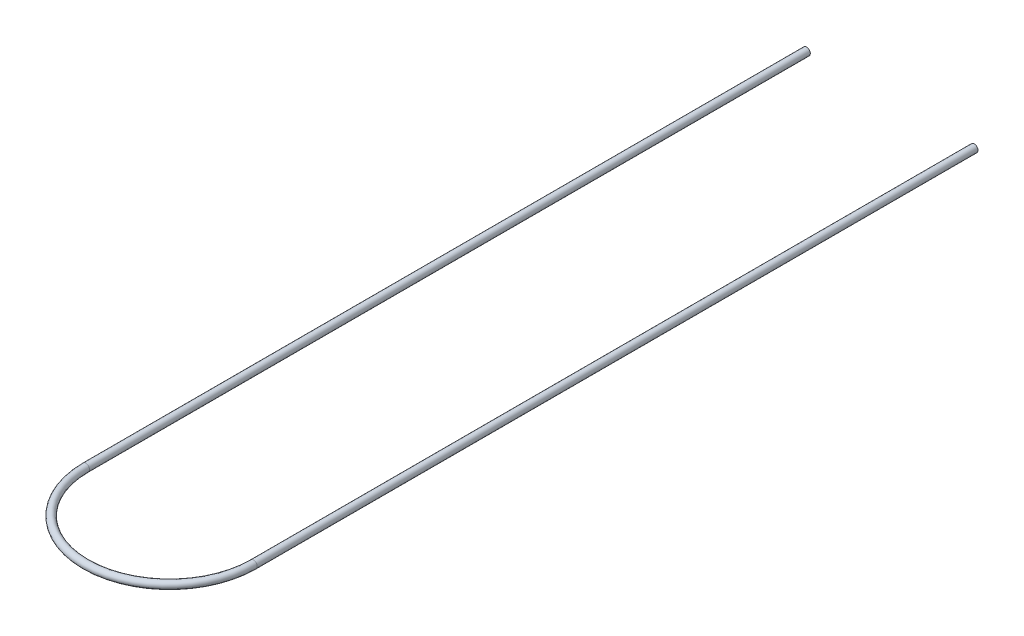
ISO-10303-21;
HEADER;
FILE_DESCRIPTION(('STEP AP214'),'2;1');
FILE_NAME('part.step','',(''),(''),'','','');
FILE_SCHEMA(('AUTOMOTIVE_DESIGN { 1 0 10303 214 1 1 1 1 }'));
ENDSEC;
DATA;
#1=APPLICATION_CONTEXT('core data for automotive mechanical design processes');
#2=APPLICATION_PROTOCOL_DEFINITION('international standard','automotive_design',2000,#1);
#3=PRODUCT_CONTEXT('',#1,'mechanical');
#4=PRODUCT('Part','Part','',(#3));
#5=PRODUCT_RELATED_PRODUCT_CATEGORY('part','',(#4));
#6=PRODUCT_DEFINITION_FORMATION('','',#4);
#7=PRODUCT_DEFINITION_CONTEXT('part definition',#1,'design');
#8=PRODUCT_DEFINITION('design','',#6,#7);
#9=PRODUCT_DEFINITION_SHAPE('','',#8);
#10=(LENGTH_UNIT() NAMED_UNIT(*) SI_UNIT(.MILLI.,.METRE.));
#11=(NAMED_UNIT(*) PLANE_ANGLE_UNIT() SI_UNIT($,.RADIAN.));
#12=(NAMED_UNIT(*) SI_UNIT($,.STERADIAN.) SOLID_ANGLE_UNIT());
#13=UNCERTAINTY_MEASURE_WITH_UNIT(LENGTH_MEASURE(1.E-05),#10,'distance_accuracy_value','');
#14=(GEOMETRIC_REPRESENTATION_CONTEXT(3) GLOBAL_UNCERTAINTY_ASSIGNED_CONTEXT((#13)) GLOBAL_UNIT_ASSIGNED_CONTEXT((#10,
#11,#12)) REPRESENTATION_CONTEXT('',''));
#15=CARTESIAN_POINT('',(0.,0.,0.));
#16=DIRECTION('',(0.,0.,1.));
#17=DIRECTION('',(1.,0.,0.));
#18=AXIS2_PLACEMENT_3D('',#15,#16,#17);
#19=CARTESIAN_POINT('',(-40.,0.,299.999999999999));
#20=DIRECTION('',(0.,0.,1.));
#21=DIRECTION('',(1.,0.,0.));
#22=AXIS2_PLACEMENT_3D('',#19,#20,#21);
#23=CYLINDRICAL_SURFACE('',#22,11.1);
#24=CARTESIAN_POINT('',(-39.9999999999997,0.,2440.));
#25=DIRECTION('',(0.,0.,1.));
#26=DIRECTION('',(1.,0.,0.));
#27=AXIS2_PLACEMENT_3D('',#24,#25,#26);
#28=CIRCLE('',#27,11.1);
#29=CARTESIAN_POINT('',(-51.0999999999996,0.,2440.));
#30=VERTEX_POINT('',#29);
#31=EDGE_CURVE('E54',#30,#30,#28,.T.);
#32=ORIENTED_EDGE('',*,*,#31,.F.);
#33=EDGE_LOOP('',(#32));
#34=FACE_BOUND('',#33,.T.);
#35=CARTESIAN_POINT('',(-40.,0.,299.999999999999));
#36=DIRECTION('',(0.,0.,1.));
#37=DIRECTION('',(1.,0.,0.));
#38=AXIS2_PLACEMENT_3D('',#35,#36,#37);
#39=CIRCLE('',#38,11.1);
#40=CARTESIAN_POINT('',(-28.9,0.,299.999999999999));
#41=VERTEX_POINT('',#40);
#42=EDGE_CURVE('E52',#41,#41,#39,.T.);
#43=ORIENTED_EDGE('',*,*,#42,.T.);
#44=EDGE_LOOP('',(#43));
#45=FACE_BOUND('',#44,.T.);
#46=ADVANCED_FACE('F31',(#34,#45),#23,.T.);
#47=CARTESIAN_POINT('',(208.925,0.,2440.));
#48=DIRECTION('',(0.,1.,0.));
#49=DIRECTION('',(0.,0.,1.));
#50=AXIS2_PLACEMENT_3D('',#47,#48,#49);
#51=TOROIDAL_SURFACE('',#50,248.925,11.1);
#52=CARTESIAN_POINT('',(457.85,0.,2440.));
#53=DIRECTION('',(0.,0.,-1.));
#54=DIRECTION('',(-1.,0.,0.));
#55=AXIS2_PLACEMENT_3D('',#52,#53,#54);
#56=CIRCLE('',#55,11.1);
#57=CARTESIAN_POINT('',(468.95,0.,2440.));
#58=VERTEX_POINT('',#57);
#59=EDGE_CURVE('E35',#58,#58,#56,.T.);
#60=CARTESIAN_POINT('',(208.925,0.,2440.));
#61=DIRECTION('',(0.,1.,0.));
#62=DIRECTION('',(0.,0.,1.));
#63=AXIS2_PLACEMENT_3D('',#60,#61,#62);
#64=CIRCLE('',#63,260.025);
#65=EDGE_CURVE('',#30,#58,#64,.T.);
#66=ORIENTED_EDGE('',*,*,#31,.T.);
#67=ORIENTED_EDGE('',*,*,#59,.F.);
#68=ORIENTED_EDGE('',*,*,#65,.T.);
#69=ORIENTED_EDGE('',*,*,#65,.F.);
#70=EDGE_LOOP('',(#66,#68,#67,#69));
#71=FACE_BOUND('',#70,.T.);
#72=ADVANCED_FACE('F62',(#71),#51,.T.);
#73=CARTESIAN_POINT('',(457.85,0.,2440.));
#74=DIRECTION('',(0.,0.,-1.));
#75=DIRECTION('',(-1.,0.,0.));
#76=AXIS2_PLACEMENT_3D('',#73,#74,#75);
#77=CYLINDRICAL_SURFACE('',#76,11.1);
#78=CARTESIAN_POINT('',(457.85,0.,299.999999999999));
#79=DIRECTION('',(0.,0.,-1.));
#80=DIRECTION('',(-1.,0.,0.));
#81=AXIS2_PLACEMENT_3D('',#78,#79,#80);
#82=CIRCLE('',#81,11.1);
#83=CARTESIAN_POINT('',(446.75,0.,299.999999999999));
#84=VERTEX_POINT('',#83);
#85=EDGE_CURVE('E48',#84,#84,#82,.T.);
#86=ORIENTED_EDGE('',*,*,#85,.F.);
#87=EDGE_LOOP('',(#86));
#88=FACE_BOUND('',#87,.T.);
#89=ORIENTED_EDGE('',*,*,#59,.T.);
#90=EDGE_LOOP('',(#89));
#91=FACE_BOUND('',#90,.T.);
#92=ADVANCED_FACE('F33',(#88,#91),#77,.T.);
#93=CARTESIAN_POINT('',(-40.,0.,299.999999999999));
#94=DIRECTION('',(0.,0.,1.));
#95=DIRECTION('',(1.,0.,0.));
#96=AXIS2_PLACEMENT_3D('',#93,#94,#95);
#97=PLANE('',#96);
#98=CARTESIAN_POINT('',(-40.,0.,299.999999999999));
#99=DIRECTION('',(0.,0.,1.));
#100=DIRECTION('',(1.,0.,0.));
#101=AXIS2_PLACEMENT_3D('',#98,#99,#100);
#102=CIRCLE('',#101,9.95000000000001);
#103=CARTESIAN_POINT('',(-30.05,0.,299.999999999999));
#104=VERTEX_POINT('',#103);
#105=EDGE_CURVE('E51',#104,#104,#102,.F.);
#106=ORIENTED_EDGE('',*,*,#105,.F.);
#107=EDGE_LOOP('',(#106));
#108=FACE_BOUND('',#107,.T.);
#109=ORIENTED_EDGE('',*,*,#42,.F.);
#110=EDGE_LOOP('',(#109));
#111=FACE_BOUND('',#110,.T.);
#112=ADVANCED_FACE('F68',(#108,#111),#97,.F.);
#113=CARTESIAN_POINT('',(457.85,0.,299.999999999999));
#114=DIRECTION('',(0.,0.,-1.));
#115=DIRECTION('',(-1.,0.,0.));
#116=AXIS2_PLACEMENT_3D('',#113,#114,#115);
#117=PLANE('',#116);
#118=CARTESIAN_POINT('',(457.85,0.,299.999999999999));
#119=DIRECTION('',(0.,0.,-1.));
#120=DIRECTION('',(-1.,0.,0.));
#121=AXIS2_PLACEMENT_3D('',#118,#119,#120);
#122=CIRCLE('',#121,9.95000000000001);
#123=CARTESIAN_POINT('',(447.9,0.,299.999999999999));
#124=VERTEX_POINT('',#123);
#125=EDGE_CURVE('E10',#124,#124,#122,.F.);
#126=ORIENTED_EDGE('',*,*,#125,.T.);
#127=EDGE_LOOP('',(#126));
#128=FACE_BOUND('',#127,.T.);
#129=ORIENTED_EDGE('',*,*,#85,.T.);
#130=EDGE_LOOP('',(#129));
#131=FACE_BOUND('',#130,.T.);
#132=ADVANCED_FACE('F86',(#128,#131),#117,.T.);
#133=CARTESIAN_POINT('',(-40.,0.,299.999999999999));
#134=DIRECTION('',(0.,0.,1.));
#135=DIRECTION('',(1.,0.,0.));
#136=AXIS2_PLACEMENT_3D('',#133,#134,#135);
#137=CYLINDRICAL_SURFACE('',#136,9.95000000000001);
#138=CARTESIAN_POINT('',(-39.9999999999997,0.,2440.));
#139=DIRECTION('',(0.,0.,1.));
#140=DIRECTION('',(1.,0.,0.));
#141=AXIS2_PLACEMENT_3D('',#138,#139,#140);
#142=CIRCLE('',#141,9.95000000000001);
#143=CARTESIAN_POINT('',(-49.9499999999997,0.,2440.));
#144=VERTEX_POINT('',#143);
#145=EDGE_CURVE('E44',#144,#144,#142,.F.);
#146=ORIENTED_EDGE('',*,*,#145,.F.);
#147=EDGE_LOOP('',(#146));
#148=FACE_BOUND('',#147,.T.);
#149=ORIENTED_EDGE('',*,*,#105,.T.);
#150=EDGE_LOOP('',(#149));
#151=FACE_BOUND('',#150,.T.);
#152=ADVANCED_FACE('F80',(#148,#151),#137,.F.);
#153=CARTESIAN_POINT('',(208.925,0.,2440.));
#154=DIRECTION('',(0.,1.,0.));
#155=DIRECTION('',(0.,0.,1.));
#156=AXIS2_PLACEMENT_3D('',#153,#154,#155);
#157=TOROIDAL_SURFACE('',#156,248.925,9.95000000000001);
#158=CARTESIAN_POINT('',(457.85,0.,2440.));
#159=DIRECTION('',(0.,0.,-1.));
#160=DIRECTION('',(-1.,0.,0.));
#161=AXIS2_PLACEMENT_3D('',#158,#159,#160);
#162=CIRCLE('',#161,9.95000000000001);
#163=CARTESIAN_POINT('',(467.8,0.,2440.));
#164=VERTEX_POINT('',#163);
#165=EDGE_CURVE('E39',#164,#164,#162,.F.);
#166=CARTESIAN_POINT('',(208.925,0.,2440.));
#167=DIRECTION('',(0.,1.,0.));
#168=DIRECTION('',(0.,0.,1.));
#169=AXIS2_PLACEMENT_3D('',#166,#167,#168);
#170=CIRCLE('',#169,258.875);
#171=EDGE_CURVE('',#144,#164,#170,.T.);
#172=ORIENTED_EDGE('',*,*,#145,.T.);
#173=ORIENTED_EDGE('',*,*,#165,.F.);
#174=ORIENTED_EDGE('',*,*,#171,.T.);
#175=ORIENTED_EDGE('',*,*,#171,.F.);
#176=EDGE_LOOP('',(#172,#174,#173,#175));
#177=FACE_BOUND('',#176,.T.);
#178=ADVANCED_FACE('F74',(#177),#157,.F.);
#179=CARTESIAN_POINT('',(457.85,0.,2440.));
#180=DIRECTION('',(0.,0.,-1.));
#181=DIRECTION('',(-1.,0.,0.));
#182=AXIS2_PLACEMENT_3D('',#179,#180,#181);
#183=CYLINDRICAL_SURFACE('',#182,9.95000000000001);
#184=ORIENTED_EDGE('',*,*,#125,.F.);
#185=EDGE_LOOP('',(#184));
#186=FACE_BOUND('',#185,.T.);
#187=ORIENTED_EDGE('',*,*,#165,.T.);
#188=EDGE_LOOP('',(#187));
#189=FACE_BOUND('',#188,.T.);
#190=ADVANCED_FACE('F72',(#186,#189),#183,.F.);
#191=CLOSED_SHELL('',(#46,#72,#92,#112,#132,#152,#178,#190));
#192=MANIFOLD_SOLID_BREP('B2',#191);
#193=ADVANCED_BREP_SHAPE_REPRESENTATION('',(#18,#192),#14);
#194=SHAPE_DEFINITION_REPRESENTATION(#9,#193);
ENDSEC;
END-ISO-10303-21;
